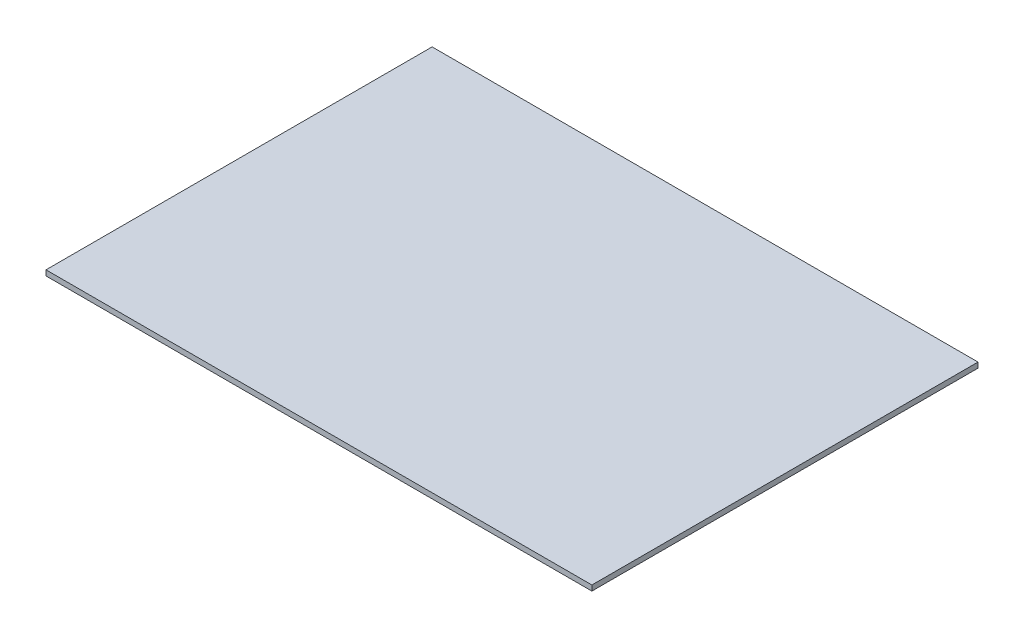
ISO-10303-21;
HEADER;
FILE_DESCRIPTION(('STEP AP214'),'2;1');
FILE_NAME('part.step','',(''),(''),'','','');
FILE_SCHEMA(('AUTOMOTIVE_DESIGN { 1 0 10303 214 1 1 1 1 }'));
ENDSEC;
DATA;
#1=APPLICATION_CONTEXT('core data for automotive mechanical design processes');
#2=APPLICATION_PROTOCOL_DEFINITION('international standard','automotive_design',2000,#1);
#3=PRODUCT_CONTEXT('',#1,'mechanical');
#4=PRODUCT('Part','Part','',(#3));
#5=PRODUCT_RELATED_PRODUCT_CATEGORY('part','',(#4));
#6=PRODUCT_DEFINITION_FORMATION('','',#4);
#7=PRODUCT_DEFINITION_CONTEXT('part definition',#1,'design');
#8=PRODUCT_DEFINITION('design','',#6,#7);
#9=PRODUCT_DEFINITION_SHAPE('','',#8);
#10=(LENGTH_UNIT() NAMED_UNIT(*) SI_UNIT(.MILLI.,.METRE.));
#11=(NAMED_UNIT(*) PLANE_ANGLE_UNIT() SI_UNIT($,.RADIAN.));
#12=(NAMED_UNIT(*) SI_UNIT($,.STERADIAN.) SOLID_ANGLE_UNIT());
#13=UNCERTAINTY_MEASURE_WITH_UNIT(LENGTH_MEASURE(1.E-05),#10,'distance_accuracy_value','');
#14=(GEOMETRIC_REPRESENTATION_CONTEXT(3) GLOBAL_UNCERTAINTY_ASSIGNED_CONTEXT((#13)) GLOBAL_UNIT_ASSIGNED_CONTEXT((#10,
#11,#12)) REPRESENTATION_CONTEXT('',''));
#15=CARTESIAN_POINT('',(0.,0.,0.));
#16=DIRECTION('',(0.,0.,1.));
#17=DIRECTION('',(1.,0.,0.));
#18=AXIS2_PLACEMENT_3D('',#15,#16,#17);
#19=CARTESIAN_POINT('',(205.,4.,-145.));
#20=DIRECTION('',(-1.,0.,0.));
#21=DIRECTION('',(0.,0.,1.));
#22=AXIS2_PLACEMENT_3D('',#19,#20,#21);
#23=PLANE('',#22);
#24=DIRECTION('',(0.,0.,-1.));
#25=VECTOR('',#24,1.);
#26=CARTESIAN_POINT('',(205.,0.,-145.));
#27=LINE('',#26,#25);
#28=CARTESIAN_POINT('',(205.,0.,145.));
#29=VERTEX_POINT('',#28);
#30=CARTESIAN_POINT('',(205.,0.,-145.));
#31=VERTEX_POINT('',#30);
#32=EDGE_CURVE('E102',#29,#31,#27,.T.);
#33=ORIENTED_EDGE('',*,*,#32,.T.);
#34=DIRECTION('',(0.,-1.,0.));
#35=VECTOR('',#34,1.);
#36=CARTESIAN_POINT('',(205.,4.,-145.));
#37=LINE('',#36,#35);
#38=CARTESIAN_POINT('',(205.,4.,-145.));
#39=VERTEX_POINT('',#38);
#40=EDGE_CURVE('E11',#39,#31,#37,.T.);
#41=ORIENTED_EDGE('',*,*,#40,.F.);
#42=DIRECTION('',(0.,0.,-1.));
#43=VECTOR('',#42,1.);
#44=CARTESIAN_POINT('',(205.,4.,-145.));
#45=LINE('',#44,#43);
#46=CARTESIAN_POINT('',(205.,4.,145.));
#47=VERTEX_POINT('',#46);
#48=EDGE_CURVE('E90',#47,#39,#45,.T.);
#49=ORIENTED_EDGE('',*,*,#48,.F.);
#50=DIRECTION('',(0.,-1.,0.));
#51=VECTOR('',#50,1.);
#52=CARTESIAN_POINT('',(205.,4.,145.));
#53=LINE('',#52,#51);
#54=EDGE_CURVE('E98',#47,#29,#53,.T.);
#55=ORIENTED_EDGE('',*,*,#54,.T.);
#56=EDGE_LOOP('',(#33,#41,#49,#55));
#57=FACE_BOUND('',#56,.T.);
#58=ADVANCED_FACE('F39',(#57),#23,.F.);
#59=CARTESIAN_POINT('',(-205.,4.,-145.));
#60=DIRECTION('',(0.,0.,1.));
#61=DIRECTION('',(1.,0.,0.));
#62=AXIS2_PLACEMENT_3D('',#59,#60,#61);
#63=PLANE('',#62);
#64=DIRECTION('',(-1.,0.,0.));
#65=VECTOR('',#64,1.);
#66=CARTESIAN_POINT('',(-205.,0.,-145.));
#67=LINE('',#66,#65);
#68=CARTESIAN_POINT('',(-205.,0.,-145.));
#69=VERTEX_POINT('',#68);
#70=EDGE_CURVE('E94',#31,#69,#67,.T.);
#71=ORIENTED_EDGE('',*,*,#70,.T.);
#72=DIRECTION('',(0.,-1.,0.));
#73=VECTOR('',#72,1.);
#74=CARTESIAN_POINT('',(-205.,4.,-145.));
#75=LINE('',#74,#73);
#76=CARTESIAN_POINT('',(-205.,4.,-145.));
#77=VERTEX_POINT('',#76);
#78=EDGE_CURVE('E47',#77,#69,#75,.T.);
#79=ORIENTED_EDGE('',*,*,#78,.F.);
#80=DIRECTION('',(-1.,0.,0.));
#81=VECTOR('',#80,1.);
#82=CARTESIAN_POINT('',(-205.,4.,-145.));
#83=LINE('',#82,#81);
#84=EDGE_CURVE('E85',#39,#77,#83,.T.);
#85=ORIENTED_EDGE('',*,*,#84,.F.);
#86=ORIENTED_EDGE('',*,*,#40,.T.);
#87=EDGE_LOOP('',(#71,#79,#85,#86));
#88=FACE_BOUND('',#87,.T.);
#89=ADVANCED_FACE('F93',(#88),#63,.F.);
#90=CARTESIAN_POINT('',(-205.,4.,-145.));
#91=DIRECTION('',(1.,0.,0.));
#92=DIRECTION('',(0.,0.,-1.));
#93=AXIS2_PLACEMENT_3D('',#90,#91,#92);
#94=PLANE('',#93);
#95=DIRECTION('',(0.,0.,1.));
#96=VECTOR('',#95,1.);
#97=CARTESIAN_POINT('',(-205.,0.,-145.));
#98=LINE('',#97,#96);
#99=CARTESIAN_POINT('',(-205.,0.,145.));
#100=VERTEX_POINT('',#99);
#101=EDGE_CURVE('E72',#69,#100,#98,.T.);
#102=ORIENTED_EDGE('',*,*,#101,.T.);
#103=DIRECTION('',(0.,-1.,0.));
#104=VECTOR('',#103,1.);
#105=CARTESIAN_POINT('',(-205.,4.,145.));
#106=LINE('',#105,#104);
#107=CARTESIAN_POINT('',(-205.,4.,145.));
#108=VERTEX_POINT('',#107);
#109=EDGE_CURVE('E95',#108,#100,#106,.T.);
#110=ORIENTED_EDGE('',*,*,#109,.F.);
#111=DIRECTION('',(0.,0.,1.));
#112=VECTOR('',#111,1.);
#113=CARTESIAN_POINT('',(-205.,4.,-145.));
#114=LINE('',#113,#112);
#115=EDGE_CURVE('E88',#77,#108,#114,.T.);
#116=ORIENTED_EDGE('',*,*,#115,.F.);
#117=ORIENTED_EDGE('',*,*,#78,.T.);
#118=EDGE_LOOP('',(#102,#110,#116,#117));
#119=FACE_BOUND('',#118,.T.);
#120=ADVANCED_FACE('F96',(#119),#94,.F.);
#121=CARTESIAN_POINT('',(-205.,4.,145.));
#122=DIRECTION('',(0.,0.,-1.));
#123=DIRECTION('',(-1.,0.,0.));
#124=AXIS2_PLACEMENT_3D('',#121,#122,#123);
#125=PLANE('',#124);
#126=DIRECTION('',(1.,0.,0.));
#127=VECTOR('',#126,1.);
#128=CARTESIAN_POINT('',(-205.,0.,145.));
#129=LINE('',#128,#127);
#130=EDGE_CURVE('E78',#100,#29,#129,.T.);
#131=ORIENTED_EDGE('',*,*,#130,.T.);
#132=ORIENTED_EDGE('',*,*,#54,.F.);
#133=DIRECTION('',(1.,0.,0.));
#134=VECTOR('',#133,1.);
#135=CARTESIAN_POINT('',(-205.,4.,145.));
#136=LINE('',#135,#134);
#137=EDGE_CURVE('E55',#108,#47,#136,.T.);
#138=ORIENTED_EDGE('',*,*,#137,.F.);
#139=ORIENTED_EDGE('',*,*,#109,.T.);
#140=EDGE_LOOP('',(#131,#132,#138,#139));
#141=FACE_BOUND('',#140,.T.);
#142=ADVANCED_FACE('F109',(#141),#125,.F.);
#143=CARTESIAN_POINT('',(0.,4.,0.));
#144=DIRECTION('',(0.,1.,0.));
#145=DIRECTION('',(0.,0.,1.));
#146=AXIS2_PLACEMENT_3D('',#143,#144,#145);
#147=PLANE('',#146);
#148=ORIENTED_EDGE('',*,*,#48,.T.);
#149=ORIENTED_EDGE('',*,*,#84,.T.);
#150=ORIENTED_EDGE('',*,*,#115,.T.);
#151=ORIENTED_EDGE('',*,*,#137,.T.);
#152=EDGE_LOOP('',(#148,#149,#150,#151));
#153=FACE_BOUND('',#152,.T.);
#154=ADVANCED_FACE('F86',(#153),#147,.T.);
#155=CARTESIAN_POINT('',(0.,0.,0.));
#156=DIRECTION('',(0.,1.,0.));
#157=DIRECTION('',(0.,0.,1.));
#158=AXIS2_PLACEMENT_3D('',#155,#156,#157);
#159=PLANE('',#158);
#160=ORIENTED_EDGE('',*,*,#32,.F.);
#161=ORIENTED_EDGE('',*,*,#130,.F.);
#162=ORIENTED_EDGE('',*,*,#101,.F.);
#163=ORIENTED_EDGE('',*,*,#70,.F.);
#164=EDGE_LOOP('',(#160,#161,#162,#163));
#165=FACE_BOUND('',#164,.T.);
#166=ADVANCED_FACE('F112',(#165),#159,.F.);
#167=CLOSED_SHELL('',(#58,#89,#120,#142,#154,#166));
#168=MANIFOLD_SOLID_BREP('B2',#167);
#169=ADVANCED_BREP_SHAPE_REPRESENTATION('',(#18,#168),#14);
#170=SHAPE_DEFINITION_REPRESENTATION(#9,#169);
ENDSEC;
END-ISO-10303-21;
